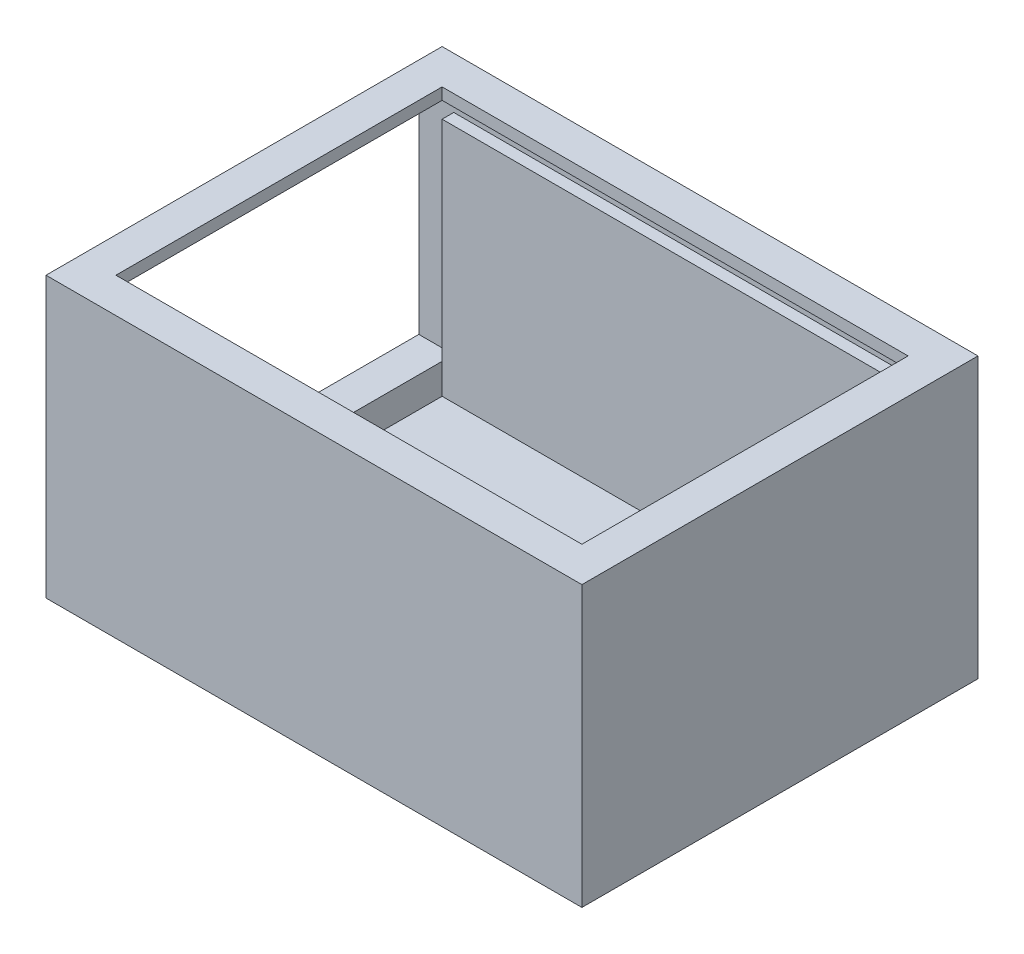
ISO-10303-21;
HEADER;
FILE_DESCRIPTION(('STEP AP214'),'2;1');
FILE_NAME('part.step','',(''),(''),'','','');
FILE_SCHEMA(('AUTOMOTIVE_DESIGN { 1 0 10303 214 1 1 1 1 }'));
ENDSEC;
DATA;
#1=APPLICATION_CONTEXT('core data for automotive mechanical design processes');
#2=APPLICATION_PROTOCOL_DEFINITION('international standard','automotive_design',2000,#1);
#3=PRODUCT_CONTEXT('',#1,'mechanical');
#4=PRODUCT('Part','Part','',(#3));
#5=PRODUCT_RELATED_PRODUCT_CATEGORY('part','',(#4));
#6=PRODUCT_DEFINITION_FORMATION('','',#4);
#7=PRODUCT_DEFINITION_CONTEXT('part definition',#1,'design');
#8=PRODUCT_DEFINITION('design','',#6,#7);
#9=PRODUCT_DEFINITION_SHAPE('','',#8);
#10=(LENGTH_UNIT() NAMED_UNIT(*) SI_UNIT(.MILLI.,.METRE.));
#11=(NAMED_UNIT(*) PLANE_ANGLE_UNIT() SI_UNIT($,.RADIAN.));
#12=(NAMED_UNIT(*) SI_UNIT($,.STERADIAN.) SOLID_ANGLE_UNIT());
#13=UNCERTAINTY_MEASURE_WITH_UNIT(LENGTH_MEASURE(1.E-05),#10,'distance_accuracy_value','');
#14=(GEOMETRIC_REPRESENTATION_CONTEXT(3) GLOBAL_UNCERTAINTY_ASSIGNED_CONTEXT((#13)) GLOBAL_UNIT_ASSIGNED_CONTEXT((#10,
#11,#12)) REPRESENTATION_CONTEXT('',''));
#15=CARTESIAN_POINT('',(0.,0.,0.));
#16=DIRECTION('',(0.,0.,1.));
#17=DIRECTION('',(1.,0.,0.));
#18=AXIS2_PLACEMENT_3D('',#15,#16,#17);
#19=CARTESIAN_POINT('',(7.5,2.49999999999997,-77.5));
#20=DIRECTION('',(-1.,0.,0.));
#21=DIRECTION('',(0.,0.,1.));
#22=AXIS2_PLACEMENT_3D('',#19,#20,#21);
#23=PLANE('',#22);
#24=DIRECTION('',(0.,1.,0.));
#25=VECTOR('',#24,1.);
#26=CARTESIAN_POINT('',(7.5,2.49999999999997,-7.5));
#27=LINE('',#26,#25);
#28=CARTESIAN_POINT('',(7.5,57.5,-7.5));
#29=VERTEX_POINT('',#28);
#30=CARTESIAN_POINT('',(7.5,60.,-7.5));
#31=VERTEX_POINT('',#30);
#32=EDGE_CURVE('E263',#29,#31,#27,.T.);
#33=ORIENTED_EDGE('',*,*,#32,.F.);
#34=DIRECTION('',(0.,0.,-1.));
#35=VECTOR('',#34,1.);
#36=CARTESIAN_POINT('',(7.5,57.5,-77.5));
#37=LINE('',#36,#35);
#38=CARTESIAN_POINT('',(7.5,57.5,-77.5));
#39=VERTEX_POINT('',#38);
#40=EDGE_CURVE('E56',#29,#39,#37,.T.);
#41=ORIENTED_EDGE('',*,*,#40,.T.);
#42=DIRECTION('',(0.,1.,0.));
#43=VECTOR('',#42,1.);
#44=CARTESIAN_POINT('',(7.5,2.49999999999997,-77.5));
#45=LINE('',#44,#43);
#46=CARTESIAN_POINT('',(7.5,60.,-77.5));
#47=VERTEX_POINT('',#46);
#48=EDGE_CURVE('E279',#39,#47,#45,.T.);
#49=ORIENTED_EDGE('',*,*,#48,.T.);
#50=DIRECTION('',(0.,0.,1.));
#51=VECTOR('',#50,1.);
#52=CARTESIAN_POINT('',(7.5,60.,-77.5));
#53=LINE('',#52,#51);
#54=EDGE_CURVE('E249',#47,#31,#53,.T.);
#55=ORIENTED_EDGE('',*,*,#54,.T.);
#56=EDGE_LOOP('',(#33,#41,#49,#55));
#57=FACE_BOUND('',#56,.T.);
#58=ADVANCED_FACE('F33',(#57),#23,.F.);
#59=CARTESIAN_POINT('',(7.5,2.49999999999997,-77.5));
#60=DIRECTION('',(0.,0.,-1.));
#61=DIRECTION('',(-1.,0.,0.));
#62=AXIS2_PLACEMENT_3D('',#59,#60,#61);
#63=PLANE('',#62);
#64=ORIENTED_EDGE('',*,*,#48,.F.);
#65=DIRECTION('',(1.,0.,0.));
#66=VECTOR('',#65,1.);
#67=CARTESIAN_POINT('',(7.5,57.5,-77.5));
#68=LINE('',#67,#66);
#69=CARTESIAN_POINT('',(107.5,57.5,-77.5));
#70=VERTEX_POINT('',#69);
#71=EDGE_CURVE('E245',#39,#70,#68,.T.);
#72=ORIENTED_EDGE('',*,*,#71,.T.);
#73=DIRECTION('',(0.,1.,0.));
#74=VECTOR('',#73,1.);
#75=CARTESIAN_POINT('',(107.5,2.49999999999997,-77.5));
#76=LINE('',#75,#74);
#77=CARTESIAN_POINT('',(107.5,60.,-77.5));
#78=VERTEX_POINT('',#77);
#79=EDGE_CURVE('E283',#70,#78,#76,.T.);
#80=ORIENTED_EDGE('',*,*,#79,.T.);
#81=DIRECTION('',(-1.,0.,0.));
#82=VECTOR('',#81,1.);
#83=CARTESIAN_POINT('',(7.5,60.,-77.5));
#84=LINE('',#83,#82);
#85=EDGE_CURVE('E254',#78,#47,#84,.T.);
#86=ORIENTED_EDGE('',*,*,#85,.T.);
#87=EDGE_LOOP('',(#64,#72,#80,#86));
#88=FACE_BOUND('',#87,.T.);
#89=ADVANCED_FACE('F360',(#88),#63,.F.);
#90=CARTESIAN_POINT('',(107.5,2.49999999999997,-77.5));
#91=DIRECTION('',(1.,0.,0.));
#92=DIRECTION('',(0.,0.,-1.));
#93=AXIS2_PLACEMENT_3D('',#90,#91,#92);
#94=PLANE('',#93);
#95=ORIENTED_EDGE('',*,*,#79,.F.);
#96=DIRECTION('',(0.,0.,1.));
#97=VECTOR('',#96,1.);
#98=CARTESIAN_POINT('',(107.5,57.5,-77.5));
#99=LINE('',#98,#97);
#100=CARTESIAN_POINT('',(107.5,57.5,-7.50000000000001));
#101=VERTEX_POINT('',#100);
#102=EDGE_CURVE('E242',#70,#101,#99,.T.);
#103=ORIENTED_EDGE('',*,*,#102,.T.);
#104=DIRECTION('',(0.,1.,0.));
#105=VECTOR('',#104,1.);
#106=CARTESIAN_POINT('',(107.5,2.49999999999997,-7.50000000000001));
#107=LINE('',#106,#105);
#108=CARTESIAN_POINT('',(107.5,60.,-7.50000000000001));
#109=VERTEX_POINT('',#108);
#110=EDGE_CURVE('E287',#101,#109,#107,.T.);
#111=ORIENTED_EDGE('',*,*,#110,.T.);
#112=DIRECTION('',(0.,0.,-1.));
#113=VECTOR('',#112,1.);
#114=CARTESIAN_POINT('',(107.5,60.,-77.5));
#115=LINE('',#114,#113);
#116=EDGE_CURVE('E269',#109,#78,#115,.T.);
#117=ORIENTED_EDGE('',*,*,#116,.T.);
#118=EDGE_LOOP('',(#95,#103,#111,#117));
#119=FACE_BOUND('',#118,.T.);
#120=ADVANCED_FACE('F367',(#119),#94,.F.);
#121=CARTESIAN_POINT('',(7.5,2.49999999999997,-7.5));
#122=DIRECTION('',(0.,0.,1.));
#123=DIRECTION('',(1.,0.,0.));
#124=AXIS2_PLACEMENT_3D('',#121,#122,#123);
#125=PLANE('',#124);
#126=ORIENTED_EDGE('',*,*,#110,.F.);
#127=DIRECTION('',(-1.,0.,0.));
#128=VECTOR('',#127,1.);
#129=CARTESIAN_POINT('',(7.5,57.5,-7.5));
#130=LINE('',#129,#128);
#131=EDGE_CURVE('E41',#101,#29,#130,.T.);
#132=ORIENTED_EDGE('',*,*,#131,.T.);
#133=ORIENTED_EDGE('',*,*,#32,.T.);
#134=DIRECTION('',(1.,0.,0.));
#135=VECTOR('',#134,1.);
#136=CARTESIAN_POINT('',(7.5,60.,-7.5));
#137=LINE('',#136,#135);
#138=EDGE_CURVE('E266',#31,#109,#137,.T.);
#139=ORIENTED_EDGE('',*,*,#138,.T.);
#140=EDGE_LOOP('',(#126,#132,#133,#139));
#141=FACE_BOUND('',#140,.T.);
#142=ADVANCED_FACE('F326',(#141),#125,.F.);
#143=CARTESIAN_POINT('',(0.,60.,0.));
#144=DIRECTION('',(1.,0.,0.));
#145=DIRECTION('',(0.,0.,-1.));
#146=AXIS2_PLACEMENT_3D('',#143,#144,#145);
#147=PLANE('',#146);
#148=DIRECTION('',(0.,0.,1.));
#149=VECTOR('',#148,1.);
#150=CARTESIAN_POINT('',(0.,8.99999999999999,-80.));
#151=LINE('',#150,#149);
#152=CARTESIAN_POINT('',(0.,8.99999999999999,-80.));
#153=VERTEX_POINT('',#152);
#154=CARTESIAN_POINT('',(0.,8.99999999999999,-5.00360791033552));
#155=VERTEX_POINT('',#154);
#156=EDGE_CURVE('E195',#153,#155,#151,.T.);
#157=ORIENTED_EDGE('',*,*,#156,.F.);
#158=DIRECTION('',(0.,-1.,0.));
#159=VECTOR('',#158,1.);
#160=CARTESIAN_POINT('',(0.,57.5,-80.));
#161=LINE('',#160,#159);
#162=CARTESIAN_POINT('',(0.,57.5,-80.));
#163=VERTEX_POINT('',#162);
#164=EDGE_CURVE('E177',#163,#153,#161,.T.);
#165=ORIENTED_EDGE('',*,*,#164,.F.);
#166=DIRECTION('',(0.,0.,-1.));
#167=VECTOR('',#166,1.);
#168=CARTESIAN_POINT('',(0.,57.5,-80.));
#169=LINE('',#168,#167);
#170=CARTESIAN_POINT('',(0.,57.5,-5.));
#171=VERTEX_POINT('',#170);
#172=EDGE_CURVE('E210',#171,#163,#169,.T.);
#173=ORIENTED_EDGE('',*,*,#172,.F.);
#174=DIRECTION('',(0.,1.,0.));
#175=VECTOR('',#174,1.);
#176=CARTESIAN_POINT('',(0.,57.5,-5.));
#177=LINE('',#176,#175);
#178=CARTESIAN_POINT('',(0.,54.,-5.));
#179=VERTEX_POINT('',#178);
#180=EDGE_CURVE('E223',#179,#171,#177,.T.);
#181=ORIENTED_EDGE('',*,*,#180,.F.);
#182=DIRECTION('',(0.,0.,1.));
#183=VECTOR('',#182,1.);
#184=CARTESIAN_POINT('',(0.,54.,-80.));
#185=LINE('',#184,#183);
#186=CARTESIAN_POINT('',(0.,54.,-5.00360791033552));
#187=VERTEX_POINT('',#186);
#188=EDGE_CURVE('E221',#187,#179,#185,.T.);
#189=ORIENTED_EDGE('',*,*,#188,.F.);
#190=DIRECTION('',(0.,1.,0.));
#191=VECTOR('',#190,1.);
#192=CARTESIAN_POINT('',(0.,54.,-5.00360791033552));
#193=LINE('',#192,#191);
#194=EDGE_CURVE('E193',#155,#187,#193,.T.);
#195=ORIENTED_EDGE('',*,*,#194,.F.);
#196=EDGE_LOOP('',(#157,#165,#173,#181,#189,#195));
#197=FACE_BOUND('',#196,.T.);
#198=DIRECTION('',(0.,0.,1.));
#199=VECTOR('',#198,1.);
#200=CARTESIAN_POINT('',(0.,0.,0.));
#201=LINE('',#200,#199);
#202=CARTESIAN_POINT('',(0.,0.,-85.));
#203=VERTEX_POINT('',#202);
#204=CARTESIAN_POINT('',(0.,0.,0.));
#205=VERTEX_POINT('',#204);
#206=EDGE_CURVE('E277',#203,#205,#201,.T.);
#207=ORIENTED_EDGE('',*,*,#206,.T.);
#208=DIRECTION('',(0.,-1.,0.));
#209=VECTOR('',#208,1.);
#210=CARTESIAN_POINT('',(0.,60.,0.));
#211=LINE('',#210,#209);
#212=CARTESIAN_POINT('',(0.,60.,0.));
#213=VERTEX_POINT('',#212);
#214=EDGE_CURVE('E318',#213,#205,#211,.T.);
#215=ORIENTED_EDGE('',*,*,#214,.F.);
#216=DIRECTION('',(0.,0.,1.));
#217=VECTOR('',#216,1.);
#218=CARTESIAN_POINT('',(0.,60.,0.));
#219=LINE('',#218,#217);
#220=CARTESIAN_POINT('',(0.,60.,-85.));
#221=VERTEX_POINT('',#220);
#222=EDGE_CURVE('E292',#221,#213,#219,.T.);
#223=ORIENTED_EDGE('',*,*,#222,.F.);
#224=DIRECTION('',(0.,-1.,0.));
#225=VECTOR('',#224,1.);
#226=CARTESIAN_POINT('',(0.,60.,-85.));
#227=LINE('',#226,#225);
#228=EDGE_CURVE('E302',#221,#203,#227,.T.);
#229=ORIENTED_EDGE('',*,*,#228,.T.);
#230=EDGE_LOOP('',(#207,#215,#223,#229));
#231=FACE_BOUND('',#230,.T.);
#232=ADVANCED_FACE('F35',(#197,#231),#147,.F.);
#233=CARTESIAN_POINT('',(0.,60.,0.));
#234=DIRECTION('',(0.,0.,-1.));
#235=DIRECTION('',(-1.,0.,0.));
#236=AXIS2_PLACEMENT_3D('',#233,#234,#235);
#237=PLANE('',#236);
#238=DIRECTION('',(1.,0.,0.));
#239=VECTOR('',#238,1.);
#240=CARTESIAN_POINT('',(0.,0.,0.));
#241=LINE('',#240,#239);
#242=CARTESIAN_POINT('',(115.,0.,0.));
#243=VERTEX_POINT('',#242);
#244=EDGE_CURVE('E305',#205,#243,#241,.T.);
#245=ORIENTED_EDGE('',*,*,#244,.T.);
#246=DIRECTION('',(0.,-1.,0.));
#247=VECTOR('',#246,1.);
#248=CARTESIAN_POINT('',(115.,60.,0.));
#249=LINE('',#248,#247);
#250=CARTESIAN_POINT('',(115.,60.,0.));
#251=VERTEX_POINT('',#250);
#252=EDGE_CURVE('E315',#251,#243,#249,.T.);
#253=ORIENTED_EDGE('',*,*,#252,.F.);
#254=DIRECTION('',(1.,0.,0.));
#255=VECTOR('',#254,1.);
#256=CARTESIAN_POINT('',(0.,60.,0.));
#257=LINE('',#256,#255);
#258=EDGE_CURVE('E295',#213,#251,#257,.T.);
#259=ORIENTED_EDGE('',*,*,#258,.F.);
#260=ORIENTED_EDGE('',*,*,#214,.T.);
#261=EDGE_LOOP('',(#245,#253,#259,#260));
#262=FACE_BOUND('',#261,.T.);
#263=ADVANCED_FACE('F386',(#262),#237,.F.);
#264=CARTESIAN_POINT('',(115.,60.,0.));
#265=DIRECTION('',(-1.,0.,0.));
#266=DIRECTION('',(0.,0.,1.));
#267=AXIS2_PLACEMENT_3D('',#264,#265,#266);
#268=PLANE('',#267);
#269=DIRECTION('',(0.,0.,-1.));
#270=VECTOR('',#269,1.);
#271=CARTESIAN_POINT('',(115.,0.,0.));
#272=LINE('',#271,#270);
#273=CARTESIAN_POINT('',(115.,0.,-85.));
#274=VERTEX_POINT('',#273);
#275=EDGE_CURVE('E307',#243,#274,#272,.T.);
#276=ORIENTED_EDGE('',*,*,#275,.T.);
#277=DIRECTION('',(0.,-1.,0.));
#278=VECTOR('',#277,1.);
#279=CARTESIAN_POINT('',(115.,60.,-85.));
#280=LINE('',#279,#278);
#281=CARTESIAN_POINT('',(115.,60.,-85.));
#282=VERTEX_POINT('',#281);
#283=EDGE_CURVE('E312',#282,#274,#280,.T.);
#284=ORIENTED_EDGE('',*,*,#283,.F.);
#285=DIRECTION('',(0.,0.,-1.));
#286=VECTOR('',#285,1.);
#287=CARTESIAN_POINT('',(115.,60.,0.));
#288=LINE('',#287,#286);
#289=EDGE_CURVE('E298',#251,#282,#288,.T.);
#290=ORIENTED_EDGE('',*,*,#289,.F.);
#291=ORIENTED_EDGE('',*,*,#252,.T.);
#292=EDGE_LOOP('',(#276,#284,#290,#291));
#293=FACE_BOUND('',#292,.T.);
#294=ADVANCED_FACE('F391',(#293),#268,.F.);
#295=CARTESIAN_POINT('',(0.,60.,-85.));
#296=DIRECTION('',(0.,0.,1.));
#297=DIRECTION('',(1.,0.,0.));
#298=AXIS2_PLACEMENT_3D('',#295,#296,#297);
#299=PLANE('',#298);
#300=DIRECTION('',(-1.,0.,0.));
#301=VECTOR('',#300,1.);
#302=CARTESIAN_POINT('',(0.,0.,-85.));
#303=LINE('',#302,#301);
#304=EDGE_CURVE('E296',#274,#203,#303,.T.);
#305=ORIENTED_EDGE('',*,*,#304,.T.);
#306=ORIENTED_EDGE('',*,*,#228,.F.);
#307=DIRECTION('',(-1.,0.,0.));
#308=VECTOR('',#307,1.);
#309=CARTESIAN_POINT('',(0.,60.,-85.));
#310=LINE('',#309,#308);
#311=EDGE_CURVE('E300',#282,#221,#310,.T.);
#312=ORIENTED_EDGE('',*,*,#311,.F.);
#313=ORIENTED_EDGE('',*,*,#283,.T.);
#314=EDGE_LOOP('',(#305,#306,#312,#313));
#315=FACE_BOUND('',#314,.T.);
#316=ADVANCED_FACE('F410',(#315),#299,.F.);
#317=CARTESIAN_POINT('',(0.,60.,0.));
#318=DIRECTION('',(0.,-1.,0.));
#319=DIRECTION('',(0.,0.,-1.));
#320=AXIS2_PLACEMENT_3D('',#317,#318,#319);
#321=PLANE('',#320);
#322=ORIENTED_EDGE('',*,*,#138,.F.);
#323=ORIENTED_EDGE('',*,*,#54,.F.);
#324=ORIENTED_EDGE('',*,*,#85,.F.);
#325=ORIENTED_EDGE('',*,*,#116,.F.);
#326=EDGE_LOOP('',(#322,#323,#324,#325));
#327=FACE_BOUND('',#326,.T.);
#328=ORIENTED_EDGE('',*,*,#222,.T.);
#329=ORIENTED_EDGE('',*,*,#258,.T.);
#330=ORIENTED_EDGE('',*,*,#289,.T.);
#331=ORIENTED_EDGE('',*,*,#311,.T.);
#332=EDGE_LOOP('',(#328,#329,#330,#331));
#333=FACE_BOUND('',#332,.T.);
#334=ADVANCED_FACE('F406',(#327,#333),#321,.F.);
#335=CARTESIAN_POINT('',(0.,0.,0.));
#336=DIRECTION('',(0.,-1.,0.));
#337=DIRECTION('',(0.,0.,-1.));
#338=AXIS2_PLACEMENT_3D('',#335,#336,#337);
#339=PLANE('',#338);
#340=ORIENTED_EDGE('',*,*,#206,.F.);
#341=ORIENTED_EDGE('',*,*,#304,.F.);
#342=ORIENTED_EDGE('',*,*,#275,.F.);
#343=ORIENTED_EDGE('',*,*,#244,.F.);
#344=EDGE_LOOP('',(#340,#341,#342,#343));
#345=FACE_BOUND('',#344,.T.);
#346=ADVANCED_FACE('F401',(#345),#339,.T.);
#347=CARTESIAN_POINT('',(109.,57.5,-80.));
#348=DIRECTION('',(0.,1.,0.));
#349=DIRECTION('',(0.,0.,1.));
#350=AXIS2_PLACEMENT_3D('',#347,#348,#349);
#351=PLANE('',#350);
#352=ORIENTED_EDGE('',*,*,#172,.T.);
#353=DIRECTION('',(-1.,0.,0.));
#354=VECTOR('',#353,1.);
#355=CARTESIAN_POINT('',(109.,57.5,-80.));
#356=LINE('',#355,#354);
#357=CARTESIAN_POINT('',(109.,57.5,-80.));
#358=VERTEX_POINT('',#357);
#359=EDGE_CURVE('E228',#358,#163,#356,.T.);
#360=ORIENTED_EDGE('',*,*,#359,.F.);
#361=DIRECTION('',(0.,0.,-1.));
#362=VECTOR('',#361,1.);
#363=CARTESIAN_POINT('',(109.,57.5,-80.));
#364=LINE('',#363,#362);
#365=CARTESIAN_POINT('',(109.,57.5,-5.));
#366=VERTEX_POINT('',#365);
#367=EDGE_CURVE('E216',#366,#358,#364,.T.);
#368=ORIENTED_EDGE('',*,*,#367,.F.);
#369=DIRECTION('',(-1.,0.,0.));
#370=VECTOR('',#369,1.);
#371=CARTESIAN_POINT('',(109.,57.5,-5.));
#372=LINE('',#371,#370);
#373=EDGE_CURVE('E231',#366,#171,#372,.T.);
#374=ORIENTED_EDGE('',*,*,#373,.T.);
#375=EDGE_LOOP('',(#352,#360,#368,#374));
#376=FACE_BOUND('',#375,.T.);
#377=ORIENTED_EDGE('',*,*,#131,.F.);
#378=ORIENTED_EDGE('',*,*,#102,.F.);
#379=ORIENTED_EDGE('',*,*,#71,.F.);
#380=ORIENTED_EDGE('',*,*,#40,.F.);
#381=EDGE_LOOP('',(#377,#378,#379,#380));
#382=FACE_BOUND('',#381,.T.);
#383=ADVANCED_FACE('F420',(#376,#382),#351,.F.);
#384=CARTESIAN_POINT('',(109.,54.,-80.));
#385=DIRECTION('',(0.,-1.,0.));
#386=DIRECTION('',(0.,0.,-1.));
#387=AXIS2_PLACEMENT_3D('',#384,#385,#386);
#388=PLANE('',#387);
#389=DIRECTION('',(0.,0.,-1.));
#390=VECTOR('',#389,1.);
#391=CARTESIAN_POINT('',(7.5,54.,-80.));
#392=LINE('',#391,#390);
#393=CARTESIAN_POINT('',(7.5,54.,-5.00360791033552));
#394=VERTEX_POINT('',#393);
#395=CARTESIAN_POINT('',(7.5,54.,-7.50000000000001));
#396=VERTEX_POINT('',#395);
#397=EDGE_CURVE('E181',#394,#396,#392,.T.);
#398=ORIENTED_EDGE('',*,*,#397,.F.);
#399=DIRECTION('',(-1.,0.,0.));
#400=VECTOR('',#399,1.);
#401=CARTESIAN_POINT('',(7.5,54.,-5.00360791033552));
#402=LINE('',#401,#400);
#403=EDGE_CURVE('E202',#394,#187,#402,.T.);
#404=ORIENTED_EDGE('',*,*,#403,.T.);
#405=ORIENTED_EDGE('',*,*,#188,.T.);
#406=DIRECTION('',(-1.,0.,0.));
#407=VECTOR('',#406,1.);
#408=CARTESIAN_POINT('',(109.,54.,-5.));
#409=LINE('',#408,#407);
#410=CARTESIAN_POINT('',(109.,54.,-5.));
#411=VERTEX_POINT('',#410);
#412=EDGE_CURVE('E233',#411,#179,#409,.T.);
#413=ORIENTED_EDGE('',*,*,#412,.F.);
#414=DIRECTION('',(0.,0.,1.));
#415=VECTOR('',#414,1.);
#416=CARTESIAN_POINT('',(109.,54.,-80.));
#417=LINE('',#416,#415);
#418=CARTESIAN_POINT('',(109.,54.,-80.));
#419=VERTEX_POINT('',#418);
#420=EDGE_CURVE('E209',#419,#411,#417,.T.);
#421=ORIENTED_EDGE('',*,*,#420,.F.);
#422=DIRECTION('',(-1.,0.,0.));
#423=VECTOR('',#422,1.);
#424=CARTESIAN_POINT('',(109.,54.,-80.));
#425=LINE('',#424,#423);
#426=CARTESIAN_POINT('',(7.5,54.,-80.));
#427=VERTEX_POINT('',#426);
#428=EDGE_CURVE('E219',#419,#427,#425,.T.);
#429=ORIENTED_EDGE('',*,*,#428,.T.);
#430=CARTESIAN_POINT('',(7.5,54.,-77.5));
#431=VERTEX_POINT('',#430);
#432=EDGE_CURVE('E192',#431,#427,#392,.T.);
#433=ORIENTED_EDGE('',*,*,#432,.F.);
#434=DIRECTION('',(-1.,0.,0.));
#435=VECTOR('',#434,1.);
#436=CARTESIAN_POINT('',(7.5,54.,-77.5));
#437=LINE('',#436,#435);
#438=CARTESIAN_POINT('',(107.5,54.,-77.5));
#439=VERTEX_POINT('',#438);
#440=EDGE_CURVE('E239',#439,#431,#437,.T.);
#441=ORIENTED_EDGE('',*,*,#440,.F.);
#442=DIRECTION('',(0.,0.,-1.));
#443=VECTOR('',#442,1.);
#444=CARTESIAN_POINT('',(107.5,54.,-77.5));
#445=LINE('',#444,#443);
#446=CARTESIAN_POINT('',(107.5,54.,-7.50000000000001));
#447=VERTEX_POINT('',#446);
#448=EDGE_CURVE('E230',#447,#439,#445,.T.);
#449=ORIENTED_EDGE('',*,*,#448,.F.);
#450=DIRECTION('',(1.,0.,0.));
#451=VECTOR('',#450,1.);
#452=CARTESIAN_POINT('',(7.5,54.,-7.5));
#453=LINE('',#452,#451);
#454=EDGE_CURVE('E321',#396,#447,#453,.T.);
#455=ORIENTED_EDGE('',*,*,#454,.F.);
#456=EDGE_LOOP('',(#398,#404,#405,#413,#421,#429,#433,#441,#449,#455));
#457=FACE_BOUND('',#456,.T.);
#458=ADVANCED_FACE('F339',(#457),#388,.F.);
#459=CARTESIAN_POINT('',(109.,57.5,-80.));
#460=DIRECTION('',(0.,0.,-1.));
#461=DIRECTION('',(-1.,0.,0.));
#462=AXIS2_PLACEMENT_3D('',#459,#460,#461);
#463=PLANE('',#462);
#464=ORIENTED_EDGE('',*,*,#164,.T.);
#465=DIRECTION('',(-1.,0.,0.));
#466=VECTOR('',#465,1.);
#467=CARTESIAN_POINT('',(7.5,8.99999999999999,-80.));
#468=LINE('',#467,#466);
#469=CARTESIAN_POINT('',(7.5,8.99999999999999,-80.));
#470=VERTEX_POINT('',#469);
#471=EDGE_CURVE('E170',#470,#153,#468,.T.);
#472=ORIENTED_EDGE('',*,*,#471,.F.);
#473=DIRECTION('',(0.,-1.,0.));
#474=VECTOR('',#473,1.);
#475=CARTESIAN_POINT('',(7.5,54.,-80.));
#476=LINE('',#475,#474);
#477=EDGE_CURVE('E174',#427,#470,#476,.T.);
#478=ORIENTED_EDGE('',*,*,#477,.F.);
#479=ORIENTED_EDGE('',*,*,#428,.F.);
#480=DIRECTION('',(0.,-1.,0.));
#481=VECTOR('',#480,1.);
#482=CARTESIAN_POINT('',(109.,57.5,-80.));
#483=LINE('',#482,#481);
#484=EDGE_CURVE('E206',#358,#419,#483,.T.);
#485=ORIENTED_EDGE('',*,*,#484,.F.);
#486=ORIENTED_EDGE('',*,*,#359,.T.);
#487=EDGE_LOOP('',(#464,#472,#478,#479,#485,#486));
#488=FACE_BOUND('',#487,.T.);
#489=ADVANCED_FACE('F172',(#488),#463,.F.);
#490=CARTESIAN_POINT('',(109.,57.5,-5.));
#491=DIRECTION('',(0.,0.,1.));
#492=DIRECTION('',(1.,0.,0.));
#493=AXIS2_PLACEMENT_3D('',#490,#491,#492);
#494=PLANE('',#493);
#495=ORIENTED_EDGE('',*,*,#180,.T.);
#496=ORIENTED_EDGE('',*,*,#373,.F.);
#497=DIRECTION('',(0.,1.,0.));
#498=VECTOR('',#497,1.);
#499=CARTESIAN_POINT('',(109.,57.5,-5.));
#500=LINE('',#499,#498);
#501=EDGE_CURVE('E213',#411,#366,#500,.T.);
#502=ORIENTED_EDGE('',*,*,#501,.F.);
#503=ORIENTED_EDGE('',*,*,#412,.T.);
#504=EDGE_LOOP('',(#495,#496,#502,#503));
#505=FACE_BOUND('',#504,.T.);
#506=ADVANCED_FACE('F438',(#505),#494,.F.);
#507=CARTESIAN_POINT('',(109.,0.,0.));
#508=DIRECTION('',(-1.,0.,0.));
#509=DIRECTION('',(0.,0.,1.));
#510=AXIS2_PLACEMENT_3D('',#507,#508,#509);
#511=PLANE('',#510);
#512=ORIENTED_EDGE('',*,*,#484,.T.);
#513=ORIENTED_EDGE('',*,*,#420,.T.);
#514=ORIENTED_EDGE('',*,*,#501,.T.);
#515=ORIENTED_EDGE('',*,*,#367,.T.);
#516=EDGE_LOOP('',(#512,#513,#514,#515));
#517=FACE_BOUND('',#516,.T.);
#518=ADVANCED_FACE('F381',(#517),#511,.T.);
#519=CARTESIAN_POINT('',(0.,2.49999999999997,0.));
#520=DIRECTION('',(0.,1.,0.));
#521=DIRECTION('',(0.,0.,1.));
#522=AXIS2_PLACEMENT_3D('',#519,#520,#521);
#523=PLANE('',#522);
#524=DIRECTION('',(0.,0.,1.));
#525=VECTOR('',#524,1.);
#526=CARTESIAN_POINT('',(7.5,2.49999999999997,-77.5));
#527=LINE('',#526,#525);
#528=CARTESIAN_POINT('',(7.5,2.49999999999997,-77.5));
#529=VERTEX_POINT('',#528);
#530=CARTESIAN_POINT('',(7.5,2.49999999999997,-7.5));
#531=VERTEX_POINT('',#530);
#532=EDGE_CURVE('E250',#529,#531,#527,.T.);
#533=ORIENTED_EDGE('',*,*,#532,.T.);
#534=DIRECTION('',(1.,0.,0.));
#535=VECTOR('',#534,1.);
#536=CARTESIAN_POINT('',(7.5,2.49999999999997,-7.5));
#537=LINE('',#536,#535);
#538=CARTESIAN_POINT('',(107.5,2.49999999999997,-7.50000000000001));
#539=VERTEX_POINT('',#538);
#540=EDGE_CURVE('E253',#531,#539,#537,.T.);
#541=ORIENTED_EDGE('',*,*,#540,.T.);
#542=DIRECTION('',(0.,0.,-1.));
#543=VECTOR('',#542,1.);
#544=CARTESIAN_POINT('',(107.5,2.49999999999997,-77.5));
#545=LINE('',#544,#543);
#546=CARTESIAN_POINT('',(107.5,2.49999999999997,-77.5));
#547=VERTEX_POINT('',#546);
#548=EDGE_CURVE('E257',#539,#547,#545,.T.);
#549=ORIENTED_EDGE('',*,*,#548,.T.);
#550=DIRECTION('',(-1.,0.,0.));
#551=VECTOR('',#550,1.);
#552=CARTESIAN_POINT('',(7.5,2.49999999999997,-77.5));
#553=LINE('',#552,#551);
#554=EDGE_CURVE('E260',#547,#529,#553,.T.);
#555=ORIENTED_EDGE('',*,*,#554,.T.);
#556=EDGE_LOOP('',(#533,#541,#549,#555));
#557=FACE_BOUND('',#556,.T.);
#558=ADVANCED_FACE('F348',(#557),#523,.T.);
#559=CARTESIAN_POINT('',(7.5,8.99999999999999,-7.5));
#560=VERTEX_POINT('',#559);
#561=EDGE_CURVE('E288',#531,#560,#27,.T.);
#562=ORIENTED_EDGE('',*,*,#561,.T.);
#563=EDGE_CURVE('E291',#560,#396,#27,.T.);
#564=ORIENTED_EDGE('',*,*,#563,.T.);
#565=ORIENTED_EDGE('',*,*,#454,.T.);
#566=EDGE_CURVE('E284',#539,#447,#107,.T.);
#567=ORIENTED_EDGE('',*,*,#566,.F.);
#568=ORIENTED_EDGE('',*,*,#540,.F.);
#569=EDGE_LOOP('',(#562,#564,#565,#567,#568));
#570=FACE_BOUND('',#569,.T.);
#571=ADVANCED_FACE('F334',(#570),#125,.F.);
#572=ORIENTED_EDGE('',*,*,#566,.T.);
#573=ORIENTED_EDGE('',*,*,#448,.T.);
#574=EDGE_CURVE('E280',#547,#439,#76,.T.);
#575=ORIENTED_EDGE('',*,*,#574,.F.);
#576=ORIENTED_EDGE('',*,*,#548,.F.);
#577=EDGE_LOOP('',(#572,#573,#575,#576));
#578=FACE_BOUND('',#577,.T.);
#579=ADVANCED_FACE('F341',(#578),#94,.F.);
#580=ORIENTED_EDGE('',*,*,#574,.T.);
#581=ORIENTED_EDGE('',*,*,#440,.T.);
#582=CARTESIAN_POINT('',(7.5,8.99999999999999,-77.5));
#583=VERTEX_POINT('',#582);
#584=EDGE_CURVE('E278',#583,#431,#45,.T.);
#585=ORIENTED_EDGE('',*,*,#584,.F.);
#586=EDGE_CURVE('E274',#529,#583,#45,.T.);
#587=ORIENTED_EDGE('',*,*,#586,.F.);
#588=ORIENTED_EDGE('',*,*,#554,.F.);
#589=EDGE_LOOP('',(#580,#581,#585,#587,#588));
#590=FACE_BOUND('',#589,.T.);
#591=ADVANCED_FACE('F345',(#590),#63,.F.);
#592=ORIENTED_EDGE('',*,*,#586,.T.);
#593=DIRECTION('',(0.,0.,1.));
#594=VECTOR('',#593,1.);
#595=CARTESIAN_POINT('',(7.5,8.99999999999999,-77.5));
#596=LINE('',#595,#594);
#597=EDGE_CURVE('E11',#583,#560,#596,.T.);
#598=ORIENTED_EDGE('',*,*,#597,.T.);
#599=ORIENTED_EDGE('',*,*,#561,.F.);
#600=ORIENTED_EDGE('',*,*,#532,.F.);
#601=EDGE_LOOP('',(#592,#598,#599,#600));
#602=FACE_BOUND('',#601,.T.);
#603=ADVANCED_FACE('F350',(#602),#23,.F.);
#604=CARTESIAN_POINT('',(7.5,0.,0.));
#605=DIRECTION('',(-1.,0.,0.));
#606=DIRECTION('',(0.,0.,1.));
#607=AXIS2_PLACEMENT_3D('',#604,#605,#606);
#608=PLANE('',#607);
#609=ORIENTED_EDGE('',*,*,#563,.F.);
#610=DIRECTION('',(0.,0.,1.));
#611=VECTOR('',#610,1.);
#612=CARTESIAN_POINT('',(7.5,8.99999999999999,-80.));
#613=LINE('',#612,#611);
#614=CARTESIAN_POINT('',(7.5,8.99999999999999,-5.00360791033552));
#615=VERTEX_POINT('',#614);
#616=EDGE_CURVE('E48',#560,#615,#613,.T.);
#617=ORIENTED_EDGE('',*,*,#616,.T.);
#618=DIRECTION('',(0.,1.,0.));
#619=VECTOR('',#618,1.);
#620=CARTESIAN_POINT('',(7.5,54.,-5.00360791033552));
#621=LINE('',#620,#619);
#622=EDGE_CURVE('E188',#615,#394,#621,.T.);
#623=ORIENTED_EDGE('',*,*,#622,.T.);
#624=ORIENTED_EDGE('',*,*,#397,.T.);
#625=EDGE_LOOP('',(#609,#617,#623,#624));
#626=FACE_BOUND('',#625,.T.);
#627=ADVANCED_FACE('F352',(#626),#608,.T.);
#628=ORIENTED_EDGE('',*,*,#584,.T.);
#629=ORIENTED_EDGE('',*,*,#432,.T.);
#630=ORIENTED_EDGE('',*,*,#477,.T.);
#631=EDGE_CURVE('E184',#470,#583,#613,.T.);
#632=ORIENTED_EDGE('',*,*,#631,.T.);
#633=EDGE_LOOP('',(#628,#629,#630,#632));
#634=FACE_BOUND('',#633,.T.);
#635=ADVANCED_FACE('F190',(#634),#608,.T.);
#636=CARTESIAN_POINT('',(7.5,54.,-5.00360791033552));
#637=DIRECTION('',(0.,0.,1.));
#638=DIRECTION('',(0.,-1.,0.));
#639=AXIS2_PLACEMENT_3D('',#636,#637,#638);
#640=PLANE('',#639);
#641=ORIENTED_EDGE('',*,*,#194,.T.);
#642=ORIENTED_EDGE('',*,*,#403,.F.);
#643=ORIENTED_EDGE('',*,*,#622,.F.);
#644=DIRECTION('',(-1.,0.,0.));
#645=VECTOR('',#644,1.);
#646=CARTESIAN_POINT('',(7.5,8.99999999999999,-5.00360791033552));
#647=LINE('',#646,#645);
#648=EDGE_CURVE('E180',#615,#155,#647,.T.);
#649=ORIENTED_EDGE('',*,*,#648,.T.);
#650=EDGE_LOOP('',(#641,#642,#643,#649));
#651=FACE_BOUND('',#650,.T.);
#652=ADVANCED_FACE('F441',(#651),#640,.F.);
#653=CARTESIAN_POINT('',(7.5,8.99999999999999,-80.));
#654=DIRECTION('',(0.,-1.,0.));
#655=DIRECTION('',(0.,0.,-1.));
#656=AXIS2_PLACEMENT_3D('',#653,#654,#655);
#657=PLANE('',#656);
#658=ORIENTED_EDGE('',*,*,#156,.T.);
#659=ORIENTED_EDGE('',*,*,#648,.F.);
#660=ORIENTED_EDGE('',*,*,#616,.F.);
#661=ORIENTED_EDGE('',*,*,#597,.F.);
#662=ORIENTED_EDGE('',*,*,#631,.F.);
#663=ORIENTED_EDGE('',*,*,#471,.T.);
#664=EDGE_LOOP('',(#658,#659,#660,#661,#662,#663));
#665=FACE_BOUND('',#664,.T.);
#666=ADVANCED_FACE('F185',(#665),#657,.F.);
#667=CLOSED_SHELL('',(#58,#89,#120,#142,#232,#263,#294,#316,#334,#346,#383,#458,#489,#506,#518,
#558,#571,#579,#591,#603,#627,#635,#652,#666));
#668=MANIFOLD_SOLID_BREP('B2',#667);
#669=ADVANCED_BREP_SHAPE_REPRESENTATION('',(#18,#668),#14);
#670=SHAPE_DEFINITION_REPRESENTATION(#9,#669);
ENDSEC;
END-ISO-10303-21;
